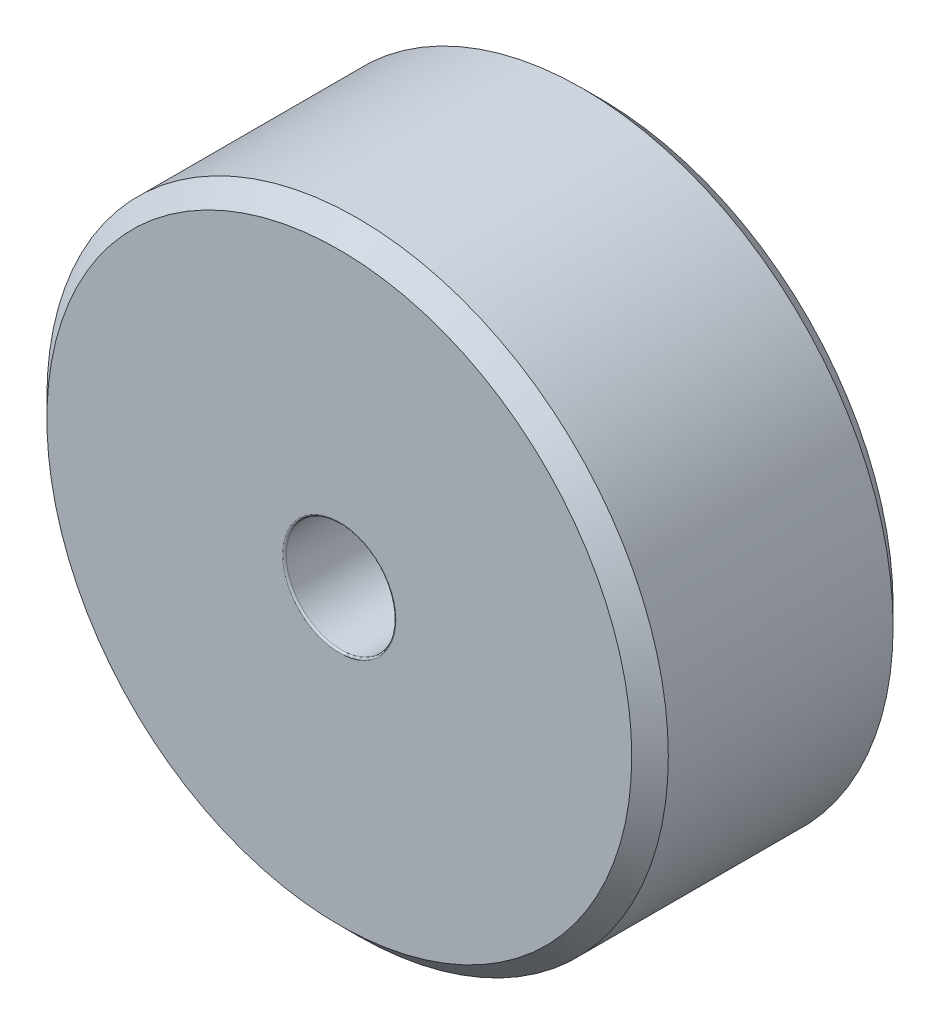
ISO-10303-21;
HEADER;
FILE_DESCRIPTION(('STEP AP214'),'2;1');
FILE_NAME('part.step','',(''),(''),'','','');
FILE_SCHEMA(('AUTOMOTIVE_DESIGN { 1 0 10303 214 1 1 1 1 }'));
ENDSEC;
DATA;
#1=APPLICATION_CONTEXT('core data for automotive mechanical design processes');
#2=APPLICATION_PROTOCOL_DEFINITION('international standard','automotive_design',2000,#1);
#3=PRODUCT_CONTEXT('',#1,'mechanical');
#4=PRODUCT('Part','Part','',(#3));
#5=PRODUCT_RELATED_PRODUCT_CATEGORY('part','',(#4));
#6=PRODUCT_DEFINITION_FORMATION('','',#4);
#7=PRODUCT_DEFINITION_CONTEXT('part definition',#1,'design');
#8=PRODUCT_DEFINITION('design','',#6,#7);
#9=PRODUCT_DEFINITION_SHAPE('','',#8);
#10=(LENGTH_UNIT() NAMED_UNIT(*) SI_UNIT(.MILLI.,.METRE.));
#11=(NAMED_UNIT(*) PLANE_ANGLE_UNIT() SI_UNIT($,.RADIAN.));
#12=(NAMED_UNIT(*) SI_UNIT($,.STERADIAN.) SOLID_ANGLE_UNIT());
#13=UNCERTAINTY_MEASURE_WITH_UNIT(LENGTH_MEASURE(1.E-05),#10,'distance_accuracy_value','');
#14=(GEOMETRIC_REPRESENTATION_CONTEXT(3) GLOBAL_UNCERTAINTY_ASSIGNED_CONTEXT((#13)) GLOBAL_UNIT_ASSIGNED_CONTEXT((#10,
#11,#12)) REPRESENTATION_CONTEXT('',''));
#15=CARTESIAN_POINT('',(0.,0.,0.));
#16=DIRECTION('',(0.,0.,1.));
#17=DIRECTION('',(1.,0.,0.));
#18=AXIS2_PLACEMENT_3D('',#15,#16,#17);
#19=CARTESIAN_POINT('',(0.,0.,0.));
#20=DIRECTION('',(0.,0.,1.));
#21=DIRECTION('',(1.,0.,0.));
#22=AXIS2_PLACEMENT_3D('',#19,#20,#21);
#23=PLANE('',#22);
#24=CARTESIAN_POINT('',(0.,0.,0.));
#25=DIRECTION('',(0.,0.,1.));
#26=DIRECTION('',(1.,0.,0.));
#27=AXIS2_PLACEMENT_3D('',#24,#25,#26);
#28=CIRCLE('',#27,16.);
#29=CARTESIAN_POINT('',(16.,0.,0.));
#30=VERTEX_POINT('',#29);
#31=EDGE_CURVE('E72',#30,#30,#28,.F.);
#32=ORIENTED_EDGE('',*,*,#31,.T.);
#33=EDGE_LOOP('',(#32));
#34=FACE_BOUND('',#33,.T.);
#35=CARTESIAN_POINT('',(0.,0.,0.));
#36=DIRECTION('',(0.,0.,1.));
#37=DIRECTION('',(1.,0.,0.));
#38=AXIS2_PLACEMENT_3D('',#35,#36,#37);
#39=CIRCLE('',#38,4.25);
#40=CARTESIAN_POINT('',(4.25,0.,0.));
#41=VERTEX_POINT('',#40);
#42=EDGE_CURVE('E81',#41,#41,#39,.F.);
#43=ORIENTED_EDGE('',*,*,#42,.F.);
#44=EDGE_LOOP('',(#43));
#45=FACE_BOUND('',#44,.T.);
#46=ADVANCED_FACE('F43',(#34,#45),#23,.F.);
#47=CARTESIAN_POINT('',(0.,0.,14.3));
#48=DIRECTION('',(0.,0.,1.));
#49=DIRECTION('',(1.,0.,0.));
#50=AXIS2_PLACEMENT_3D('',#47,#48,#49);
#51=PLANE('',#50);
#52=CARTESIAN_POINT('',(0.,0.,14.3));
#53=DIRECTION('',(0.,0.,1.));
#54=DIRECTION('',(1.,0.,0.));
#55=AXIS2_PLACEMENT_3D('',#52,#53,#54);
#56=CIRCLE('',#55,3.1);
#57=CARTESIAN_POINT('',(3.1,0.,14.3));
#58=VERTEX_POINT('',#57);
#59=EDGE_CURVE('E10',#58,#58,#56,.F.);
#60=ORIENTED_EDGE('',*,*,#59,.T.);
#61=EDGE_LOOP('',(#60));
#62=FACE_BOUND('',#61,.T.);
#63=CARTESIAN_POINT('',(0.,0.,14.3));
#64=DIRECTION('',(0.,0.,1.));
#65=DIRECTION('',(1.,0.,0.));
#66=AXIS2_PLACEMENT_3D('',#63,#64,#65);
#67=CIRCLE('',#66,16.);
#68=CARTESIAN_POINT('',(16.,0.,14.3));
#69=VERTEX_POINT('',#68);
#70=EDGE_CURVE('E69',#69,#69,#67,.T.);
#71=ORIENTED_EDGE('',*,*,#70,.T.);
#72=EDGE_LOOP('',(#71));
#73=FACE_BOUND('',#72,.T.);
#74=ADVANCED_FACE('F88',(#62,#73),#51,.T.);
#75=CARTESIAN_POINT('',(0.,0.,14.3));
#76=DIRECTION('',(0.,0.,-1.));
#77=DIRECTION('',(-1.,0.,0.));
#78=AXIS2_PLACEMENT_3D('',#75,#76,#77);
#79=CYLINDRICAL_SURFACE('',#78,17.);
#80=CARTESIAN_POINT('',(0.,0.,1.));
#81=DIRECTION('',(0.,0.,1.));
#82=DIRECTION('',(1.,0.,0.));
#83=AXIS2_PLACEMENT_3D('',#80,#81,#82);
#84=CIRCLE('',#83,17.);
#85=CARTESIAN_POINT('',(17.,0.,1.));
#86=VERTEX_POINT('',#85);
#87=EDGE_CURVE('E75',#86,#86,#84,.T.);
#88=ORIENTED_EDGE('',*,*,#87,.T.);
#89=EDGE_LOOP('',(#88));
#90=FACE_BOUND('',#89,.T.);
#91=CARTESIAN_POINT('',(0.,0.,13.3));
#92=DIRECTION('',(0.,0.,1.));
#93=DIRECTION('',(1.,0.,0.));
#94=AXIS2_PLACEMENT_3D('',#91,#92,#93);
#95=CIRCLE('',#94,17.);
#96=CARTESIAN_POINT('',(17.,0.,13.3));
#97=VERTEX_POINT('',#96);
#98=EDGE_CURVE('E78',#97,#97,#95,.F.);
#99=ORIENTED_EDGE('',*,*,#98,.T.);
#100=EDGE_LOOP('',(#99));
#101=FACE_BOUND('',#100,.T.);
#102=ADVANCED_FACE('F94',(#90,#101),#79,.T.);
#103=CARTESIAN_POINT('',(0.,0.,14.3));
#104=DIRECTION('',(0.,0.,-1.));
#105=DIRECTION('',(-1.,0.,0.));
#106=AXIS2_PLACEMENT_3D('',#103,#104,#105);
#107=CYLINDRICAL_SURFACE('',#106,3.);
#108=CARTESIAN_POINT('',(0.,0.,-0.6));
#109=DIRECTION('',(0.,0.,-1.));
#110=DIRECTION('',(-1.,0.,0.));
#111=AXIS2_PLACEMENT_3D('',#108,#109,#110);
#112=CIRCLE('',#111,3.);
#113=CARTESIAN_POINT('',(-3.,0.,-0.6));
#114=VERTEX_POINT('',#113);
#115=EDGE_CURVE('E63',#114,#114,#112,.T.);
#116=ORIENTED_EDGE('',*,*,#115,.T.);
#117=EDGE_LOOP('',(#116));
#118=FACE_BOUND('',#117,.T.);
#119=CARTESIAN_POINT('',(0.,0.,14.2));
#120=DIRECTION('',(0.,0.,1.));
#121=DIRECTION('',(1.,0.,0.));
#122=AXIS2_PLACEMENT_3D('',#119,#120,#121);
#123=CIRCLE('',#122,3.);
#124=CARTESIAN_POINT('',(3.,0.,14.2));
#125=VERTEX_POINT('',#124);
#126=EDGE_CURVE('E66',#125,#125,#123,.T.);
#127=ORIENTED_EDGE('',*,*,#126,.T.);
#128=EDGE_LOOP('',(#127));
#129=FACE_BOUND('',#128,.T.);
#130=ADVANCED_FACE('F100',(#118,#129),#107,.F.);
#131=CARTESIAN_POINT('',(0.,0.,-0.7));
#132=DIRECTION('',(0.,0.,-1.));
#133=DIRECTION('',(-1.,0.,0.));
#134=AXIS2_PLACEMENT_3D('',#131,#132,#133);
#135=PLANE('',#134);
#136=CARTESIAN_POINT('',(0.,0.,-0.7));
#137=DIRECTION('',(0.,0.,-1.));
#138=DIRECTION('',(-1.,0.,0.));
#139=AXIS2_PLACEMENT_3D('',#136,#137,#138);
#140=CIRCLE('',#139,3.1);
#141=CARTESIAN_POINT('',(-3.1,0.,-0.7));
#142=VERTEX_POINT('',#141);
#143=EDGE_CURVE('E54',#142,#142,#140,.F.);
#144=ORIENTED_EDGE('',*,*,#143,.T.);
#145=EDGE_LOOP('',(#144));
#146=FACE_BOUND('',#145,.T.);
#147=CARTESIAN_POINT('',(0.,0.,-0.7));
#148=DIRECTION('',(0.,0.,-1.));
#149=DIRECTION('',(-1.,0.,0.));
#150=AXIS2_PLACEMENT_3D('',#147,#148,#149);
#151=CIRCLE('',#150,4.15);
#152=CARTESIAN_POINT('',(-4.15,0.,-0.7));
#153=VERTEX_POINT('',#152);
#154=EDGE_CURVE('E58',#153,#153,#151,.T.);
#155=ORIENTED_EDGE('',*,*,#154,.T.);
#156=EDGE_LOOP('',(#155));
#157=FACE_BOUND('',#156,.T.);
#158=ADVANCED_FACE('F129',(#146,#157),#135,.T.);
#159=CARTESIAN_POINT('',(0.,0.,-0.7));
#160=DIRECTION('',(0.,0.,1.));
#161=DIRECTION('',(1.,0.,0.));
#162=AXIS2_PLACEMENT_3D('',#159,#160,#161);
#163=CYLINDRICAL_SURFACE('',#162,4.25);
#164=CARTESIAN_POINT('',(0.,0.,-0.6));
#165=DIRECTION('',(0.,0.,-1.));
#166=DIRECTION('',(-1.,0.,0.));
#167=AXIS2_PLACEMENT_3D('',#164,#165,#166);
#168=CIRCLE('',#167,4.25);
#169=CARTESIAN_POINT('',(-4.25,0.,-0.6));
#170=VERTEX_POINT('',#169);
#171=EDGE_CURVE('E50',#170,#170,#168,.F.);
#172=ORIENTED_EDGE('',*,*,#171,.T.);
#173=EDGE_LOOP('',(#172));
#174=FACE_BOUND('',#173,.T.);
#175=ORIENTED_EDGE('',*,*,#42,.T.);
#176=EDGE_LOOP('',(#175));
#177=FACE_BOUND('',#176,.T.);
#178=ADVANCED_FACE('F85',(#174,#177),#163,.T.);
#179=CARTESIAN_POINT('',(0.,0.,1.));
#180=DIRECTION('',(0.,0.,1.));
#181=DIRECTION('',(1.,0.,0.));
#182=AXIS2_PLACEMENT_3D('',#179,#180,#181);
#183=CONICAL_SURFACE('',#182,17.,0.785398163397448);
#184=ORIENTED_EDGE('',*,*,#31,.F.);
#185=EDGE_LOOP('',(#184));
#186=FACE_BOUND('',#185,.T.);
#187=ORIENTED_EDGE('',*,*,#87,.F.);
#188=EDGE_LOOP('',(#187));
#189=FACE_BOUND('',#188,.T.);
#190=ADVANCED_FACE('F103',(#186,#189),#183,.T.);
#191=CARTESIAN_POINT('',(0.,0.,14.3));
#192=DIRECTION('',(0.,0.,-1.));
#193=DIRECTION('',(-1.,0.,0.));
#194=AXIS2_PLACEMENT_3D('',#191,#192,#193);
#195=CONICAL_SURFACE('',#194,16.,0.785398163397447);
#196=ORIENTED_EDGE('',*,*,#98,.F.);
#197=EDGE_LOOP('',(#196));
#198=FACE_BOUND('',#197,.T.);
#199=ORIENTED_EDGE('',*,*,#70,.F.);
#200=EDGE_LOOP('',(#199));
#201=FACE_BOUND('',#200,.T.);
#202=ADVANCED_FACE('F109',(#198,#201),#195,.T.);
#203=CARTESIAN_POINT('',(0.,0.,-0.6));
#204=DIRECTION('',(0.,0.,-1.));
#205=DIRECTION('',(-1.,0.,0.));
#206=AXIS2_PLACEMENT_3D('',#203,#204,#205);
#207=TOROIDAL_SURFACE('',#206,3.1,0.1);
#208=ORIENTED_EDGE('',*,*,#143,.F.);
#209=EDGE_LOOP('',(#208));
#210=FACE_BOUND('',#209,.T.);
#211=ORIENTED_EDGE('',*,*,#115,.F.);
#212=EDGE_LOOP('',(#211));
#213=FACE_BOUND('',#212,.T.);
#214=ADVANCED_FACE('F115',(#210,#213),#207,.T.);
#215=CARTESIAN_POINT('',(0.,0.,-0.6));
#216=DIRECTION('',(0.,0.,-1.));
#217=DIRECTION('',(-1.,0.,0.));
#218=AXIS2_PLACEMENT_3D('',#215,#216,#217);
#219=TOROIDAL_SURFACE('',#218,4.15,0.1);
#220=ORIENTED_EDGE('',*,*,#171,.F.);
#221=EDGE_LOOP('',(#220));
#222=FACE_BOUND('',#221,.T.);
#223=ORIENTED_EDGE('',*,*,#154,.F.);
#224=EDGE_LOOP('',(#223));
#225=FACE_BOUND('',#224,.T.);
#226=ADVANCED_FACE('F118',(#222,#225),#219,.T.);
#227=CARTESIAN_POINT('',(0.,0.,14.2));
#228=DIRECTION('',(0.,0.,1.));
#229=DIRECTION('',(1.,0.,0.));
#230=AXIS2_PLACEMENT_3D('',#227,#228,#229);
#231=TOROIDAL_SURFACE('',#230,3.1,0.1);
#232=ORIENTED_EDGE('',*,*,#59,.F.);
#233=EDGE_LOOP('',(#232));
#234=FACE_BOUND('',#233,.T.);
#235=ORIENTED_EDGE('',*,*,#126,.F.);
#236=EDGE_LOOP('',(#235));
#237=FACE_BOUND('',#236,.T.);
#238=ADVANCED_FACE('F45',(#234,#237),#231,.T.);
#239=CLOSED_SHELL('',(#46,#74,#102,#130,#158,#178,#190,#202,#214,#226,#238));
#240=MANIFOLD_SOLID_BREP('B2',#239);
#241=ADVANCED_BREP_SHAPE_REPRESENTATION('',(#18,#240),#14);
#242=SHAPE_DEFINITION_REPRESENTATION(#9,#241);
ENDSEC;
END-ISO-10303-21;
